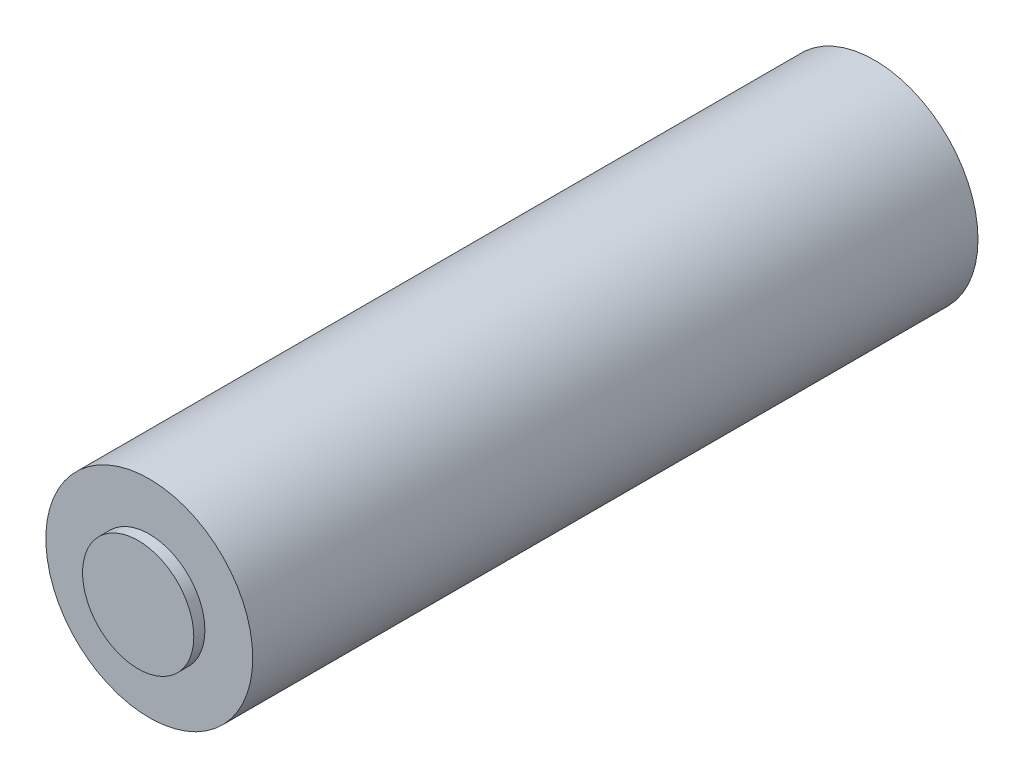
ISO-10303-21;
HEADER;
FILE_DESCRIPTION(('STEP AP214'),'2;1');
FILE_NAME('part.step','',(''),(''),'','','');
FILE_SCHEMA(('AUTOMOTIVE_DESIGN { 1 0 10303 214 1 1 1 1 }'));
ENDSEC;
DATA;
#1=APPLICATION_CONTEXT('core data for automotive mechanical design processes');
#2=APPLICATION_PROTOCOL_DEFINITION('international standard','automotive_design',2000,#1);
#3=PRODUCT_CONTEXT('',#1,'mechanical');
#4=PRODUCT('Part','Part','',(#3));
#5=PRODUCT_RELATED_PRODUCT_CATEGORY('part','',(#4));
#6=PRODUCT_DEFINITION_FORMATION('','',#4);
#7=PRODUCT_DEFINITION_CONTEXT('part definition',#1,'design');
#8=PRODUCT_DEFINITION('design','',#6,#7);
#9=PRODUCT_DEFINITION_SHAPE('','',#8);
#10=(LENGTH_UNIT() NAMED_UNIT(*) SI_UNIT(.MILLI.,.METRE.));
#11=(NAMED_UNIT(*) PLANE_ANGLE_UNIT() SI_UNIT($,.RADIAN.));
#12=(NAMED_UNIT(*) SI_UNIT($,.STERADIAN.) SOLID_ANGLE_UNIT());
#13=UNCERTAINTY_MEASURE_WITH_UNIT(LENGTH_MEASURE(1.E-05),#10,'distance_accuracy_value','');
#14=(GEOMETRIC_REPRESENTATION_CONTEXT(3) GLOBAL_UNCERTAINTY_ASSIGNED_CONTEXT((#13)) GLOBAL_UNIT_ASSIGNED_CONTEXT((#10,
#11,#12)) REPRESENTATION_CONTEXT('',''));
#15=CARTESIAN_POINT('',(0.,0.,0.));
#16=DIRECTION('',(0.,0.,1.));
#17=DIRECTION('',(1.,0.,0.));
#18=AXIS2_PLACEMENT_3D('',#15,#16,#17);
#19=CARTESIAN_POINT('',(0.,0.,65.2));
#20=DIRECTION('',(0.,0.,-1.));
#21=DIRECTION('',(-1.,0.,0.));
#22=AXIS2_PLACEMENT_3D('',#19,#20,#21);
#23=CYLINDRICAL_SURFACE('',#22,9.3);
#24=CARTESIAN_POINT('',(0.,0.,65.2));
#25=DIRECTION('',(0.,0.,1.));
#26=DIRECTION('',(1.,0.,0.));
#27=AXIS2_PLACEMENT_3D('',#24,#25,#26);
#28=CIRCLE('',#27,9.3);
#29=CARTESIAN_POINT('',(9.3,0.,65.2));
#30=VERTEX_POINT('',#29);
#31=EDGE_CURVE('E10',#30,#30,#28,.T.);
#32=ORIENTED_EDGE('',*,*,#31,.F.);
#33=EDGE_LOOP('',(#32));
#34=FACE_BOUND('',#33,.T.);
#35=CARTESIAN_POINT('',(0.,0.,0.));
#36=DIRECTION('',(0.,0.,1.));
#37=DIRECTION('',(1.,0.,0.));
#38=AXIS2_PLACEMENT_3D('',#35,#36,#37);
#39=CIRCLE('',#38,9.3);
#40=CARTESIAN_POINT('',(9.3,0.,0.));
#41=VERTEX_POINT('',#40);
#42=EDGE_CURVE('E35',#41,#41,#39,.T.);
#43=ORIENTED_EDGE('',*,*,#42,.T.);
#44=EDGE_LOOP('',(#43));
#45=FACE_BOUND('',#44,.T.);
#46=ADVANCED_FACE('F32',(#34,#45),#23,.T.);
#47=CARTESIAN_POINT('',(0.,0.,65.2));
#48=DIRECTION('',(0.,0.,1.));
#49=DIRECTION('',(1.,0.,0.));
#50=AXIS2_PLACEMENT_3D('',#47,#48,#49);
#51=PLANE('',#50);
#52=CARTESIAN_POINT('',(0.,0.,65.2));
#53=DIRECTION('',(0.,0.,1.));
#54=DIRECTION('',(1.,0.,0.));
#55=AXIS2_PLACEMENT_3D('',#52,#53,#54);
#56=CIRCLE('',#55,5.);
#57=CARTESIAN_POINT('',(5.,0.,65.2));
#58=VERTEX_POINT('',#57);
#59=EDGE_CURVE('E44',#58,#58,#56,.T.);
#60=ORIENTED_EDGE('',*,*,#59,.F.);
#61=EDGE_LOOP('',(#60));
#62=FACE_BOUND('',#61,.T.);
#63=ORIENTED_EDGE('',*,*,#31,.T.);
#64=EDGE_LOOP('',(#63));
#65=FACE_BOUND('',#64,.T.);
#66=ADVANCED_FACE('F59',(#62,#65),#51,.T.);
#67=CARTESIAN_POINT('',(0.,0.,0.));
#68=DIRECTION('',(0.,0.,1.));
#69=DIRECTION('',(1.,0.,0.));
#70=AXIS2_PLACEMENT_3D('',#67,#68,#69);
#71=PLANE('',#70);
#72=ORIENTED_EDGE('',*,*,#42,.F.);
#73=EDGE_LOOP('',(#72));
#74=FACE_BOUND('',#73,.T.);
#75=ADVANCED_FACE('F55',(#74),#71,.F.);
#76=CARTESIAN_POINT('',(0.,0.,66.2));
#77=DIRECTION('',(0.,0.,-1.));
#78=DIRECTION('',(-1.,0.,0.));
#79=AXIS2_PLACEMENT_3D('',#76,#77,#78);
#80=CYLINDRICAL_SURFACE('',#79,5.);
#81=CARTESIAN_POINT('',(0.,0.,66.2));
#82=DIRECTION('',(0.,0.,1.));
#83=DIRECTION('',(1.,0.,0.));
#84=AXIS2_PLACEMENT_3D('',#81,#82,#83);
#85=CIRCLE('',#84,5.);
#86=CARTESIAN_POINT('',(5.,0.,66.2));
#87=VERTEX_POINT('',#86);
#88=EDGE_CURVE('E42',#87,#87,#85,.T.);
#89=ORIENTED_EDGE('',*,*,#88,.F.);
#90=EDGE_LOOP('',(#89));
#91=FACE_BOUND('',#90,.T.);
#92=ORIENTED_EDGE('',*,*,#59,.T.);
#93=EDGE_LOOP('',(#92));
#94=FACE_BOUND('',#93,.T.);
#95=ADVANCED_FACE('F52',(#91,#94),#80,.T.);
#96=CARTESIAN_POINT('',(0.,0.,66.2));
#97=DIRECTION('',(0.,0.,1.));
#98=DIRECTION('',(1.,0.,0.));
#99=AXIS2_PLACEMENT_3D('',#96,#97,#98);
#100=PLANE('',#99);
#101=ORIENTED_EDGE('',*,*,#88,.T.);
#102=EDGE_LOOP('',(#101));
#103=FACE_BOUND('',#102,.T.);
#104=ADVANCED_FACE('F50',(#103),#100,.T.);
#105=CLOSED_SHELL('',(#46,#66,#75,#95,#104));
#106=MANIFOLD_SOLID_BREP('B2',#105);
#107=ADVANCED_BREP_SHAPE_REPRESENTATION('',(#18,#106),#14);
#108=SHAPE_DEFINITION_REPRESENTATION(#9,#107);
ENDSEC;
END-ISO-10303-21;
